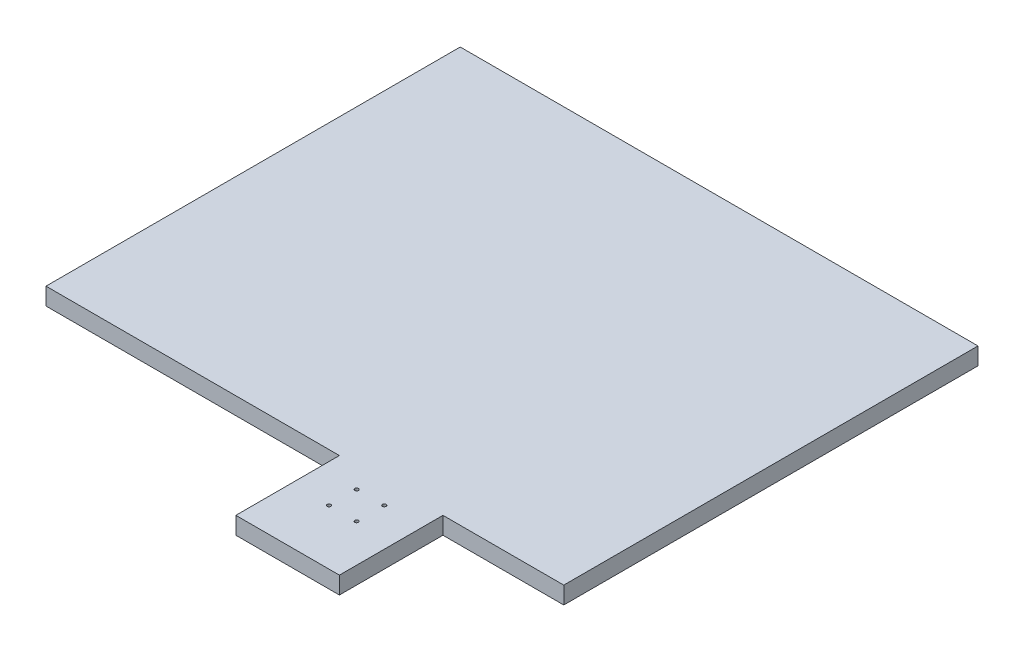
ISO-10303-21;
HEADER;
FILE_DESCRIPTION(('STEP AP214'),'2;1');
FILE_NAME('part.step','',(''),(''),'','','');
FILE_SCHEMA(('AUTOMOTIVE_DESIGN { 1 0 10303 214 1 1 1 1 }'));
ENDSEC;
DATA;
#1=APPLICATION_CONTEXT('core data for automotive mechanical design processes');
#2=APPLICATION_PROTOCOL_DEFINITION('international standard','automotive_design',2000,#1);
#3=PRODUCT_CONTEXT('',#1,'mechanical');
#4=PRODUCT('Part','Part','',(#3));
#5=PRODUCT_RELATED_PRODUCT_CATEGORY('part','',(#4));
#6=PRODUCT_DEFINITION_FORMATION('','',#4);
#7=PRODUCT_DEFINITION_CONTEXT('part definition',#1,'design');
#8=PRODUCT_DEFINITION('design','',#6,#7);
#9=PRODUCT_DEFINITION_SHAPE('','',#8);
#10=(LENGTH_UNIT() NAMED_UNIT(*) SI_UNIT(.MILLI.,.METRE.));
#11=(NAMED_UNIT(*) PLANE_ANGLE_UNIT() SI_UNIT($,.RADIAN.));
#12=(NAMED_UNIT(*) SI_UNIT($,.STERADIAN.) SOLID_ANGLE_UNIT());
#13=UNCERTAINTY_MEASURE_WITH_UNIT(LENGTH_MEASURE(1.E-05),#10,'distance_accuracy_value','');
#14=(GEOMETRIC_REPRESENTATION_CONTEXT(3) GLOBAL_UNCERTAINTY_ASSIGNED_CONTEXT((#13)) GLOBAL_UNIT_ASSIGNED_CONTEXT((#10,
#11,#12)) REPRESENTATION_CONTEXT('',''));
#15=CARTESIAN_POINT('',(0.,0.,0.));
#16=DIRECTION('',(0.,0.,1.));
#17=DIRECTION('',(1.,0.,0.));
#18=AXIS2_PLACEMENT_3D('',#15,#16,#17);
#19=CARTESIAN_POINT('',(0.,10.,0.));
#20=DIRECTION('',(0.,-1.,0.));
#21=DIRECTION('',(0.,0.,-1.));
#22=AXIS2_PLACEMENT_3D('',#19,#20,#21);
#23=PLANE('',#22);
#24=CARTESIAN_POINT('',(42.,10.,132.));
#25=DIRECTION('',(0.,-1.,0.));
#26=DIRECTION('',(0.,0.,-1.));
#27=AXIS2_PLACEMENT_3D('',#24,#25,#26);
#28=CIRCLE('',#27,1.05);
#29=CARTESIAN_POINT('',(42.,10.,130.95));
#30=VERTEX_POINT('',#29);
#31=EDGE_CURVE('E285',#30,#30,#28,.T.);
#32=ORIENTED_EDGE('',*,*,#31,.T.);
#33=EDGE_LOOP('',(#32));
#34=FACE_BOUND('',#33,.T.);
#35=CARTESIAN_POINT('',(58.0000000000003,10.,132.));
#36=DIRECTION('',(0.,1.,0.));
#37=DIRECTION('',(0.,0.,1.));
#38=AXIS2_PLACEMENT_3D('',#35,#36,#37);
#39=CIRCLE('',#38,1.05);
#40=CARTESIAN_POINT('',(58.0000000000003,10.,133.05));
#41=VERTEX_POINT('',#40);
#42=EDGE_CURVE('E281',#41,#41,#39,.T.);
#43=ORIENTED_EDGE('',*,*,#42,.F.);
#44=EDGE_LOOP('',(#43));
#45=FACE_BOUND('',#44,.T.);
#46=DIRECTION('',(0.,0.,-1.));
#47=VECTOR('',#46,1.);
#48=CARTESIAN_POINT('',(150.,10.,120.));
#49=LINE('',#48,#47);
#50=CARTESIAN_POINT('',(150.,10.,120.));
#51=VERTEX_POINT('',#50);
#52=CARTESIAN_POINT('',(150.,10.,-120.));
#53=VERTEX_POINT('',#52);
#54=EDGE_CURVE('E177',#51,#53,#49,.T.);
#55=ORIENTED_EDGE('',*,*,#54,.T.);
#56=DIRECTION('',(-1.,0.,0.));
#57=VECTOR('',#56,1.);
#58=CARTESIAN_POINT('',(-150.,10.,-120.));
#59=LINE('',#58,#57);
#60=CARTESIAN_POINT('',(-150.,10.,-120.));
#61=VERTEX_POINT('',#60);
#62=EDGE_CURVE('E105',#53,#61,#59,.T.);
#63=ORIENTED_EDGE('',*,*,#62,.T.);
#64=DIRECTION('',(0.,0.,1.));
#65=VECTOR('',#64,1.);
#66=CARTESIAN_POINT('',(-150.,10.,120.));
#67=LINE('',#66,#65);
#68=CARTESIAN_POINT('',(-150.,10.,120.));
#69=VERTEX_POINT('',#68);
#70=EDGE_CURVE('E198',#61,#69,#67,.T.);
#71=ORIENTED_EDGE('',*,*,#70,.T.);
#72=DIRECTION('',(1.,0.,0.));
#73=VECTOR('',#72,1.);
#74=CARTESIAN_POINT('',(-150.,10.,120.));
#75=LINE('',#74,#73);
#76=CARTESIAN_POINT('',(20.,10.,120.));
#77=VERTEX_POINT('',#76);
#78=EDGE_CURVE('E212',#69,#77,#75,.T.);
#79=ORIENTED_EDGE('',*,*,#78,.T.);
#80=DIRECTION('',(0.,0.,1.));
#81=VECTOR('',#80,1.);
#82=CARTESIAN_POINT('',(20.,10.,120.));
#83=LINE('',#82,#81);
#84=CARTESIAN_POINT('',(20.,10.,180.));
#85=VERTEX_POINT('',#84);
#86=EDGE_CURVE('E128',#77,#85,#83,.T.);
#87=ORIENTED_EDGE('',*,*,#86,.T.);
#88=DIRECTION('',(1.,0.,0.));
#89=VECTOR('',#88,1.);
#90=CARTESIAN_POINT('',(20.,10.,180.));
#91=LINE('',#90,#89);
#92=CARTESIAN_POINT('',(80.,10.,180.));
#93=VERTEX_POINT('',#92);
#94=EDGE_CURVE('E121',#85,#93,#91,.T.);
#95=ORIENTED_EDGE('',*,*,#94,.T.);
#96=DIRECTION('',(0.,0.,-1.));
#97=VECTOR('',#96,1.);
#98=CARTESIAN_POINT('',(80.,10.,180.));
#99=LINE('',#98,#97);
#100=CARTESIAN_POINT('',(80.,10.,120.));
#101=VERTEX_POINT('',#100);
#102=EDGE_CURVE('E125',#93,#101,#99,.T.);
#103=ORIENTED_EDGE('',*,*,#102,.T.);
#104=DIRECTION('',(1.,0.,0.));
#105=VECTOR('',#104,1.);
#106=CARTESIAN_POINT('',(80.,10.,120.));
#107=LINE('',#106,#105);
#108=EDGE_CURVE('E64',#101,#51,#107,.T.);
#109=ORIENTED_EDGE('',*,*,#108,.T.);
#110=EDGE_LOOP('',(#55,#63,#71,#79,#87,#95,#103,#109));
#111=FACE_BOUND('',#110,.T.);
#112=CARTESIAN_POINT('',(42.,10.,148.));
#113=DIRECTION('',(0.,1.,0.));
#114=DIRECTION('',(0.,0.,1.));
#115=AXIS2_PLACEMENT_3D('',#112,#113,#114);
#116=CIRCLE('',#115,1.05);
#117=CARTESIAN_POINT('',(42.,10.,149.05));
#118=VERTEX_POINT('',#117);
#119=EDGE_CURVE('E290',#118,#118,#116,.T.);
#120=ORIENTED_EDGE('',*,*,#119,.F.);
#121=EDGE_LOOP('',(#120));
#122=FACE_BOUND('',#121,.T.);
#123=CARTESIAN_POINT('',(58.0000000000002,10.,148.));
#124=DIRECTION('',(0.,-1.,0.));
#125=DIRECTION('',(0.,0.,-1.));
#126=AXIS2_PLACEMENT_3D('',#123,#124,#125);
#127=CIRCLE('',#126,1.04999999999999);
#128=CARTESIAN_POINT('',(58.0000000000002,10.,146.95));
#129=VERTEX_POINT('',#128);
#130=EDGE_CURVE('E286',#129,#129,#127,.T.);
#131=ORIENTED_EDGE('',*,*,#130,.T.);
#132=EDGE_LOOP('',(#131));
#133=FACE_BOUND('',#132,.T.);
#134=ADVANCED_FACE('F39',(#34,#45,#111,#122,#133),#23,.F.);
#135=CARTESIAN_POINT('',(0.,0.,0.));
#136=DIRECTION('',(0.,-1.,0.));
#137=DIRECTION('',(0.,0.,-1.));
#138=AXIS2_PLACEMENT_3D('',#135,#136,#137);
#139=PLANE('',#138);
#140=DIRECTION('',(0.,0.,-1.));
#141=VECTOR('',#140,1.);
#142=CARTESIAN_POINT('',(150.,0.,120.));
#143=LINE('',#142,#141);
#144=CARTESIAN_POINT('',(150.,0.,120.));
#145=VERTEX_POINT('',#144);
#146=CARTESIAN_POINT('',(150.,0.,-120.));
#147=VERTEX_POINT('',#146);
#148=EDGE_CURVE('E153',#145,#147,#143,.T.);
#149=ORIENTED_EDGE('',*,*,#148,.F.);
#150=DIRECTION('',(1.,0.,0.));
#151=VECTOR('',#150,1.);
#152=CARTESIAN_POINT('',(80.,0.,120.));
#153=LINE('',#152,#151);
#154=CARTESIAN_POINT('',(80.,0.,120.));
#155=VERTEX_POINT('',#154);
#156=EDGE_CURVE('E97',#155,#145,#153,.T.);
#157=ORIENTED_EDGE('',*,*,#156,.F.);
#158=DIRECTION('',(0.,0.,-1.));
#159=VECTOR('',#158,1.);
#160=CARTESIAN_POINT('',(80.,0.,180.));
#161=LINE('',#160,#159);
#162=CARTESIAN_POINT('',(80.,0.,180.));
#163=VERTEX_POINT('',#162);
#164=EDGE_CURVE('E172',#163,#155,#161,.T.);
#165=ORIENTED_EDGE('',*,*,#164,.F.);
#166=DIRECTION('',(1.,0.,0.));
#167=VECTOR('',#166,1.);
#168=CARTESIAN_POINT('',(20.,0.,180.));
#169=LINE('',#168,#167);
#170=CARTESIAN_POINT('',(20.,0.,180.));
#171=VERTEX_POINT('',#170);
#172=EDGE_CURVE('E138',#171,#163,#169,.T.);
#173=ORIENTED_EDGE('',*,*,#172,.F.);
#174=DIRECTION('',(0.,0.,1.));
#175=VECTOR('',#174,1.);
#176=CARTESIAN_POINT('',(20.,0.,120.));
#177=LINE('',#176,#175);
#178=CARTESIAN_POINT('',(20.,0.,120.));
#179=VERTEX_POINT('',#178);
#180=EDGE_CURVE('E167',#179,#171,#177,.T.);
#181=ORIENTED_EDGE('',*,*,#180,.F.);
#182=DIRECTION('',(1.,0.,0.));
#183=VECTOR('',#182,1.);
#184=CARTESIAN_POINT('',(-150.,0.,120.));
#185=LINE('',#184,#183);
#186=CARTESIAN_POINT('',(-150.,0.,120.));
#187=VERTEX_POINT('',#186);
#188=EDGE_CURVE('E164',#187,#179,#185,.T.);
#189=ORIENTED_EDGE('',*,*,#188,.F.);
#190=DIRECTION('',(0.,0.,1.));
#191=VECTOR('',#190,1.);
#192=CARTESIAN_POINT('',(-150.,0.,120.));
#193=LINE('',#192,#191);
#194=CARTESIAN_POINT('',(-150.,0.,-120.));
#195=VERTEX_POINT('',#194);
#196=EDGE_CURVE('E161',#195,#187,#193,.T.);
#197=ORIENTED_EDGE('',*,*,#196,.F.);
#198=DIRECTION('',(-1.,0.,0.));
#199=VECTOR('',#198,1.);
#200=CARTESIAN_POINT('',(-150.,0.,-120.));
#201=LINE('',#200,#199);
#202=EDGE_CURVE('E157',#147,#195,#201,.T.);
#203=ORIENTED_EDGE('',*,*,#202,.F.);
#204=EDGE_LOOP('',(#149,#157,#165,#173,#181,#189,#197,#203));
#205=FACE_BOUND('',#204,.T.);
#206=DIRECTION('',(-1.,0.,0.));
#207=VECTOR('',#206,1.);
#208=CARTESIAN_POINT('',(0.,0.,150.));
#209=LINE('',#208,#207);
#210=CARTESIAN_POINT('',(60.,0.,150.));
#211=VERTEX_POINT('',#210);
#212=CARTESIAN_POINT('',(40.,0.,150.));
#213=VERTEX_POINT('',#212);
#214=EDGE_CURVE('E55',#211,#213,#209,.T.);
#215=ORIENTED_EDGE('',*,*,#214,.F.);
#216=DIRECTION('',(0.,0.,-1.));
#217=VECTOR('',#216,1.);
#218=CARTESIAN_POINT('',(60.0000000000001,0.,0.));
#219=LINE('',#218,#217);
#220=CARTESIAN_POINT('',(60.,0.,130.));
#221=VERTEX_POINT('',#220);
#222=EDGE_CURVE('E236',#211,#221,#219,.T.);
#223=ORIENTED_EDGE('',*,*,#222,.T.);
#224=DIRECTION('',(-1.,0.,0.));
#225=VECTOR('',#224,1.);
#226=CARTESIAN_POINT('',(0.,0.,130.));
#227=LINE('',#226,#225);
#228=CARTESIAN_POINT('',(40.,0.,130.));
#229=VERTEX_POINT('',#228);
#230=EDGE_CURVE('E241',#221,#229,#227,.T.);
#231=ORIENTED_EDGE('',*,*,#230,.T.);
#232=DIRECTION('',(0.,0.,-1.));
#233=VECTOR('',#232,1.);
#234=CARTESIAN_POINT('',(40.,0.,0.));
#235=LINE('',#234,#233);
#236=EDGE_CURVE('E245',#213,#229,#235,.T.);
#237=ORIENTED_EDGE('',*,*,#236,.F.);
#238=EDGE_LOOP('',(#215,#223,#231,#237));
#239=FACE_BOUND('',#238,.T.);
#240=ADVANCED_FACE('F202',(#205,#239),#139,.T.);
#241=CARTESIAN_POINT('',(150.,10.,120.));
#242=DIRECTION('',(-1.,0.,0.));
#243=DIRECTION('',(0.,0.,1.));
#244=AXIS2_PLACEMENT_3D('',#241,#242,#243);
#245=PLANE('',#244);
#246=ORIENTED_EDGE('',*,*,#148,.T.);
#247=DIRECTION('',(0.,-1.,0.));
#248=VECTOR('',#247,1.);
#249=CARTESIAN_POINT('',(150.,10.,-120.));
#250=LINE('',#249,#248);
#251=EDGE_CURVE('E11',#53,#147,#250,.T.);
#252=ORIENTED_EDGE('',*,*,#251,.F.);
#253=ORIENTED_EDGE('',*,*,#54,.F.);
#254=DIRECTION('',(0.,-1.,0.));
#255=VECTOR('',#254,1.);
#256=CARTESIAN_POINT('',(150.,10.,120.));
#257=LINE('',#256,#255);
#258=EDGE_CURVE('E149',#51,#145,#257,.T.);
#259=ORIENTED_EDGE('',*,*,#258,.T.);
#260=EDGE_LOOP('',(#246,#252,#253,#259));
#261=FACE_BOUND('',#260,.T.);
#262=ADVANCED_FACE('F41',(#261),#245,.F.);
#263=CARTESIAN_POINT('',(-150.,10.,-120.));
#264=DIRECTION('',(0.,0.,1.));
#265=DIRECTION('',(1.,0.,0.));
#266=AXIS2_PLACEMENT_3D('',#263,#264,#265);
#267=PLANE('',#266);
#268=ORIENTED_EDGE('',*,*,#202,.T.);
#269=DIRECTION('',(0.,-1.,0.));
#270=VECTOR('',#269,1.);
#271=CARTESIAN_POINT('',(-150.,10.,-120.));
#272=LINE('',#271,#270);
#273=EDGE_CURVE('E48',#61,#195,#272,.T.);
#274=ORIENTED_EDGE('',*,*,#273,.F.);
#275=ORIENTED_EDGE('',*,*,#62,.F.);
#276=ORIENTED_EDGE('',*,*,#251,.T.);
#277=EDGE_LOOP('',(#268,#274,#275,#276));
#278=FACE_BOUND('',#277,.T.);
#279=ADVANCED_FACE('F338',(#278),#267,.F.);
#280=CARTESIAN_POINT('',(-150.,10.,120.));
#281=DIRECTION('',(1.,0.,0.));
#282=DIRECTION('',(0.,0.,-1.));
#283=AXIS2_PLACEMENT_3D('',#280,#281,#282);
#284=PLANE('',#283);
#285=ORIENTED_EDGE('',*,*,#196,.T.);
#286=DIRECTION('',(0.,-1.,0.));
#287=VECTOR('',#286,1.);
#288=CARTESIAN_POINT('',(-150.,10.,120.));
#289=LINE('',#288,#287);
#290=EDGE_CURVE('E188',#69,#187,#289,.T.);
#291=ORIENTED_EDGE('',*,*,#290,.F.);
#292=ORIENTED_EDGE('',*,*,#70,.F.);
#293=ORIENTED_EDGE('',*,*,#273,.T.);
#294=EDGE_LOOP('',(#285,#291,#292,#293));
#295=FACE_BOUND('',#294,.T.);
#296=ADVANCED_FACE('F196',(#295),#284,.F.);
#297=CARTESIAN_POINT('',(-150.,10.,120.));
#298=DIRECTION('',(0.,0.,-1.));
#299=DIRECTION('',(-1.,0.,0.));
#300=AXIS2_PLACEMENT_3D('',#297,#298,#299);
#301=PLANE('',#300);
#302=ORIENTED_EDGE('',*,*,#188,.T.);
#303=DIRECTION('',(0.,-1.,0.));
#304=VECTOR('',#303,1.);
#305=CARTESIAN_POINT('',(20.,10.,120.));
#306=LINE('',#305,#304);
#307=EDGE_CURVE('E184',#77,#179,#306,.T.);
#308=ORIENTED_EDGE('',*,*,#307,.F.);
#309=ORIENTED_EDGE('',*,*,#78,.F.);
#310=ORIENTED_EDGE('',*,*,#290,.T.);
#311=EDGE_LOOP('',(#302,#308,#309,#310));
#312=FACE_BOUND('',#311,.T.);
#313=ADVANCED_FACE('F207',(#312),#301,.F.);
#314=CARTESIAN_POINT('',(20.,10.,120.));
#315=DIRECTION('',(1.,0.,0.));
#316=DIRECTION('',(0.,0.,-1.));
#317=AXIS2_PLACEMENT_3D('',#314,#315,#316);
#318=PLANE('',#317);
#319=ORIENTED_EDGE('',*,*,#180,.T.);
#320=DIRECTION('',(0.,-1.,0.));
#321=VECTOR('',#320,1.);
#322=CARTESIAN_POINT('',(20.,10.,180.));
#323=LINE('',#322,#321);
#324=EDGE_CURVE('E142',#85,#171,#323,.T.);
#325=ORIENTED_EDGE('',*,*,#324,.F.);
#326=ORIENTED_EDGE('',*,*,#86,.F.);
#327=ORIENTED_EDGE('',*,*,#307,.T.);
#328=EDGE_LOOP('',(#319,#325,#326,#327));
#329=FACE_BOUND('',#328,.T.);
#330=ADVANCED_FACE('F210',(#329),#318,.F.);
#331=CARTESIAN_POINT('',(20.,10.,180.));
#332=DIRECTION('',(0.,0.,-1.));
#333=DIRECTION('',(-1.,0.,0.));
#334=AXIS2_PLACEMENT_3D('',#331,#332,#333);
#335=PLANE('',#334);
#336=ORIENTED_EDGE('',*,*,#172,.T.);
#337=DIRECTION('',(0.,-1.,0.));
#338=VECTOR('',#337,1.);
#339=CARTESIAN_POINT('',(80.,10.,180.));
#340=LINE('',#339,#338);
#341=EDGE_CURVE('E135',#93,#163,#340,.T.);
#342=ORIENTED_EDGE('',*,*,#341,.F.);
#343=ORIENTED_EDGE('',*,*,#94,.F.);
#344=ORIENTED_EDGE('',*,*,#324,.T.);
#345=EDGE_LOOP('',(#336,#342,#343,#344));
#346=FACE_BOUND('',#345,.T.);
#347=ADVANCED_FACE('F136',(#346),#335,.F.);
#348=CARTESIAN_POINT('',(80.,10.,180.));
#349=DIRECTION('',(-1.,0.,0.));
#350=DIRECTION('',(0.,0.,1.));
#351=AXIS2_PLACEMENT_3D('',#348,#349,#350);
#352=PLANE('',#351);
#353=ORIENTED_EDGE('',*,*,#164,.T.);
#354=DIRECTION('',(0.,-1.,0.));
#355=VECTOR('',#354,1.);
#356=CARTESIAN_POINT('',(80.,10.,120.));
#357=LINE('',#356,#355);
#358=EDGE_CURVE('E143',#101,#155,#357,.T.);
#359=ORIENTED_EDGE('',*,*,#358,.F.);
#360=ORIENTED_EDGE('',*,*,#102,.F.);
#361=ORIENTED_EDGE('',*,*,#341,.T.);
#362=EDGE_LOOP('',(#353,#359,#360,#361));
#363=FACE_BOUND('',#362,.T.);
#364=ADVANCED_FACE('F145',(#363),#352,.F.);
#365=CARTESIAN_POINT('',(80.,10.,120.));
#366=DIRECTION('',(0.,0.,-1.));
#367=DIRECTION('',(-1.,0.,0.));
#368=AXIS2_PLACEMENT_3D('',#365,#366,#367);
#369=PLANE('',#368);
#370=ORIENTED_EDGE('',*,*,#156,.T.);
#371=ORIENTED_EDGE('',*,*,#258,.F.);
#372=ORIENTED_EDGE('',*,*,#108,.F.);
#373=ORIENTED_EDGE('',*,*,#358,.T.);
#374=EDGE_LOOP('',(#370,#371,#372,#373));
#375=FACE_BOUND('',#374,.T.);
#376=ADVANCED_FACE('F326',(#375),#369,.F.);
#377=CARTESIAN_POINT('',(0.,8.,150.));
#378=DIRECTION('',(0.,0.,1.));
#379=DIRECTION('',(1.,0.,0.));
#380=AXIS2_PLACEMENT_3D('',#377,#378,#379);
#381=PLANE('',#380);
#382=ORIENTED_EDGE('',*,*,#214,.T.);
#383=DIRECTION('',(0.,-1.,0.));
#384=VECTOR('',#383,1.);
#385=CARTESIAN_POINT('',(40.,8.,150.));
#386=LINE('',#385,#384);
#387=CARTESIAN_POINT('',(40.,8.,150.));
#388=VERTEX_POINT('',#387);
#389=EDGE_CURVE('E222',#388,#213,#386,.T.);
#390=ORIENTED_EDGE('',*,*,#389,.F.);
#391=DIRECTION('',(-1.,0.,0.));
#392=VECTOR('',#391,1.);
#393=CARTESIAN_POINT('',(0.,8.,150.));
#394=LINE('',#393,#392);
#395=CARTESIAN_POINT('',(60.,8.,150.));
#396=VERTEX_POINT('',#395);
#397=EDGE_CURVE('E240',#396,#388,#394,.T.);
#398=ORIENTED_EDGE('',*,*,#397,.F.);
#399=DIRECTION('',(0.,-1.,0.));
#400=VECTOR('',#399,1.);
#401=CARTESIAN_POINT('',(60.,8.,150.));
#402=LINE('',#401,#400);
#403=EDGE_CURVE('E158',#396,#211,#402,.T.);
#404=ORIENTED_EDGE('',*,*,#403,.T.);
#405=EDGE_LOOP('',(#382,#390,#398,#404));
#406=FACE_BOUND('',#405,.T.);
#407=ADVANCED_FACE('F323',(#406),#381,.F.);
#408=CARTESIAN_POINT('',(60.0000000000001,8.,0.));
#409=DIRECTION('',(-1.,0.,0.));
#410=DIRECTION('',(0.,0.,1.));
#411=AXIS2_PLACEMENT_3D('',#408,#409,#410);
#412=PLANE('',#411);
#413=ORIENTED_EDGE('',*,*,#222,.F.);
#414=ORIENTED_EDGE('',*,*,#403,.F.);
#415=DIRECTION('',(0.,0.,-1.));
#416=VECTOR('',#415,1.);
#417=CARTESIAN_POINT('',(60.0000000000001,8.,0.));
#418=LINE('',#417,#416);
#419=CARTESIAN_POINT('',(60.,8.,130.));
#420=VERTEX_POINT('',#419);
#421=EDGE_CURVE('E226',#396,#420,#418,.T.);
#422=ORIENTED_EDGE('',*,*,#421,.T.);
#423=DIRECTION('',(0.,-1.,0.));
#424=VECTOR('',#423,1.);
#425=CARTESIAN_POINT('',(60.,8.,130.));
#426=LINE('',#425,#424);
#427=EDGE_CURVE('E230',#420,#221,#426,.T.);
#428=ORIENTED_EDGE('',*,*,#427,.T.);
#429=EDGE_LOOP('',(#413,#414,#422,#428));
#430=FACE_BOUND('',#429,.T.);
#431=ADVANCED_FACE('F365',(#430),#412,.T.);
#432=CARTESIAN_POINT('',(0.,8.,130.));
#433=DIRECTION('',(0.,0.,1.));
#434=DIRECTION('',(1.,0.,0.));
#435=AXIS2_PLACEMENT_3D('',#432,#433,#434);
#436=PLANE('',#435);
#437=ORIENTED_EDGE('',*,*,#230,.F.);
#438=ORIENTED_EDGE('',*,*,#427,.F.);
#439=DIRECTION('',(-1.,0.,0.));
#440=VECTOR('',#439,1.);
#441=CARTESIAN_POINT('',(0.,8.,130.));
#442=LINE('',#441,#440);
#443=CARTESIAN_POINT('',(40.,8.,130.));
#444=VERTEX_POINT('',#443);
#445=EDGE_CURVE('E255',#420,#444,#442,.T.);
#446=ORIENTED_EDGE('',*,*,#445,.T.);
#447=DIRECTION('',(0.,-1.,0.));
#448=VECTOR('',#447,1.);
#449=CARTESIAN_POINT('',(40.,8.,130.));
#450=LINE('',#449,#448);
#451=EDGE_CURVE('E225',#444,#229,#450,.T.);
#452=ORIENTED_EDGE('',*,*,#451,.T.);
#453=EDGE_LOOP('',(#437,#438,#446,#452));
#454=FACE_BOUND('',#453,.T.);
#455=ADVANCED_FACE('F373',(#454),#436,.T.);
#456=CARTESIAN_POINT('',(40.,8.,0.));
#457=DIRECTION('',(-1.,0.,0.));
#458=DIRECTION('',(0.,0.,1.));
#459=AXIS2_PLACEMENT_3D('',#456,#457,#458);
#460=PLANE('',#459);
#461=ORIENTED_EDGE('',*,*,#236,.T.);
#462=ORIENTED_EDGE('',*,*,#451,.F.);
#463=DIRECTION('',(0.,0.,-1.));
#464=VECTOR('',#463,1.);
#465=CARTESIAN_POINT('',(40.,8.,0.));
#466=LINE('',#465,#464);
#467=EDGE_CURVE('E259',#388,#444,#466,.T.);
#468=ORIENTED_EDGE('',*,*,#467,.F.);
#469=ORIENTED_EDGE('',*,*,#389,.T.);
#470=EDGE_LOOP('',(#461,#462,#468,#469));
#471=FACE_BOUND('',#470,.T.);
#472=ADVANCED_FACE('F383',(#471),#460,.F.);
#473=CARTESIAN_POINT('',(0.,8.,0.));
#474=DIRECTION('',(0.,-1.,0.));
#475=DIRECTION('',(0.,0.,-1.));
#476=AXIS2_PLACEMENT_3D('',#473,#474,#475);
#477=PLANE('',#476);
#478=CARTESIAN_POINT('',(58.0000000000002,8.,148.));
#479=DIRECTION('',(0.,-1.,0.));
#480=DIRECTION('',(0.,0.,-1.));
#481=AXIS2_PLACEMENT_3D('',#478,#479,#480);
#482=CIRCLE('',#481,1.04999999999999);
#483=CARTESIAN_POINT('',(58.0000000000002,8.,146.95));
#484=VERTEX_POINT('',#483);
#485=EDGE_CURVE('E251',#484,#484,#482,.T.);
#486=ORIENTED_EDGE('',*,*,#485,.F.);
#487=EDGE_LOOP('',(#486));
#488=FACE_BOUND('',#487,.T.);
#489=CARTESIAN_POINT('',(42.,8.,148.));
#490=DIRECTION('',(0.,-1.,0.));
#491=DIRECTION('',(0.,0.,-1.));
#492=AXIS2_PLACEMENT_3D('',#489,#490,#491);
#493=CIRCLE('',#492,1.05);
#494=CARTESIAN_POINT('',(42.,8.,146.95));
#495=VERTEX_POINT('',#494);
#496=EDGE_CURVE('E269',#495,#495,#493,.F.);
#497=ORIENTED_EDGE('',*,*,#496,.T.);
#498=EDGE_LOOP('',(#497));
#499=FACE_BOUND('',#498,.T.);
#500=CARTESIAN_POINT('',(42.,8.,132.));
#501=DIRECTION('',(0.,-1.,0.));
#502=DIRECTION('',(0.,0.,-1.));
#503=AXIS2_PLACEMENT_3D('',#500,#501,#502);
#504=CIRCLE('',#503,1.05);
#505=CARTESIAN_POINT('',(42.,8.,130.95));
#506=VERTEX_POINT('',#505);
#507=EDGE_CURVE('E273',#506,#506,#504,.T.);
#508=ORIENTED_EDGE('',*,*,#507,.F.);
#509=EDGE_LOOP('',(#508));
#510=FACE_BOUND('',#509,.T.);
#511=ORIENTED_EDGE('',*,*,#397,.T.);
#512=ORIENTED_EDGE('',*,*,#467,.T.);
#513=ORIENTED_EDGE('',*,*,#445,.F.);
#514=ORIENTED_EDGE('',*,*,#421,.F.);
#515=EDGE_LOOP('',(#511,#512,#513,#514));
#516=FACE_BOUND('',#515,.T.);
#517=CARTESIAN_POINT('',(58.0000000000003,8.,132.));
#518=DIRECTION('',(0.,-1.,0.));
#519=DIRECTION('',(0.,0.,-1.));
#520=AXIS2_PLACEMENT_3D('',#517,#518,#519);
#521=CIRCLE('',#520,1.05);
#522=CARTESIAN_POINT('',(58.0000000000003,8.,130.95));
#523=VERTEX_POINT('',#522);
#524=EDGE_CURVE('E277',#523,#523,#521,.F.);
#525=ORIENTED_EDGE('',*,*,#524,.T.);
#526=EDGE_LOOP('',(#525));
#527=FACE_BOUND('',#526,.T.);
#528=ADVANCED_FACE('F313',(#488,#499,#510,#516,#527),#477,.T.);
#529=CARTESIAN_POINT('',(58.0000000000003,10.,132.));
#530=DIRECTION('',(0.,-1.,0.));
#531=DIRECTION('',(0.,0.,-1.));
#532=AXIS2_PLACEMENT_3D('',#529,#530,#531);
#533=CYLINDRICAL_SURFACE('',#532,1.05);
#534=ORIENTED_EDGE('',*,*,#524,.F.);
#535=EDGE_LOOP('',(#534));
#536=FACE_BOUND('',#535,.T.);
#537=ORIENTED_EDGE('',*,*,#42,.T.);
#538=EDGE_LOOP('',(#537));
#539=FACE_BOUND('',#538,.T.);
#540=ADVANCED_FACE('F303',(#536,#539),#533,.F.);
#541=CARTESIAN_POINT('',(42.,10.,132.));
#542=DIRECTION('',(0.,-1.,0.));
#543=DIRECTION('',(0.,0.,-1.));
#544=AXIS2_PLACEMENT_3D('',#541,#542,#543);
#545=CYLINDRICAL_SURFACE('',#544,1.05);
#546=ORIENTED_EDGE('',*,*,#507,.T.);
#547=EDGE_LOOP('',(#546));
#548=FACE_BOUND('',#547,.T.);
#549=ORIENTED_EDGE('',*,*,#31,.F.);
#550=EDGE_LOOP('',(#549));
#551=FACE_BOUND('',#550,.T.);
#552=ADVANCED_FACE('F300',(#548,#551),#545,.F.);
#553=CARTESIAN_POINT('',(42.,10.,148.));
#554=DIRECTION('',(0.,-1.,0.));
#555=DIRECTION('',(0.,0.,-1.));
#556=AXIS2_PLACEMENT_3D('',#553,#554,#555);
#557=CYLINDRICAL_SURFACE('',#556,1.05);
#558=ORIENTED_EDGE('',*,*,#496,.F.);
#559=EDGE_LOOP('',(#558));
#560=FACE_BOUND('',#559,.T.);
#561=ORIENTED_EDGE('',*,*,#119,.T.);
#562=EDGE_LOOP('',(#561));
#563=FACE_BOUND('',#562,.T.);
#564=ADVANCED_FACE('F302',(#560,#563),#557,.F.);
#565=CARTESIAN_POINT('',(58.0000000000002,10.,148.));
#566=DIRECTION('',(0.,-1.,0.));
#567=DIRECTION('',(0.,0.,-1.));
#568=AXIS2_PLACEMENT_3D('',#565,#566,#567);
#569=CYLINDRICAL_SURFACE('',#568,1.04999999999999);
#570=ORIENTED_EDGE('',*,*,#485,.T.);
#571=EDGE_LOOP('',(#570));
#572=FACE_BOUND('',#571,.T.);
#573=ORIENTED_EDGE('',*,*,#130,.F.);
#574=EDGE_LOOP('',(#573));
#575=FACE_BOUND('',#574,.T.);
#576=ADVANCED_FACE('F310',(#572,#575),#569,.F.);
#577=CLOSED_SHELL('',(#134,#240,#262,#279,#296,#313,#330,#347,#364,#376,#407,#431,#455,#472,
#528,#540,#552,#564,#576));
#578=MANIFOLD_SOLID_BREP('B2',#577);
#579=ADVANCED_BREP_SHAPE_REPRESENTATION('',(#18,#578),#14);
#580=SHAPE_DEFINITION_REPRESENTATION(#9,#579);
ENDSEC;
END-ISO-10303-21;
